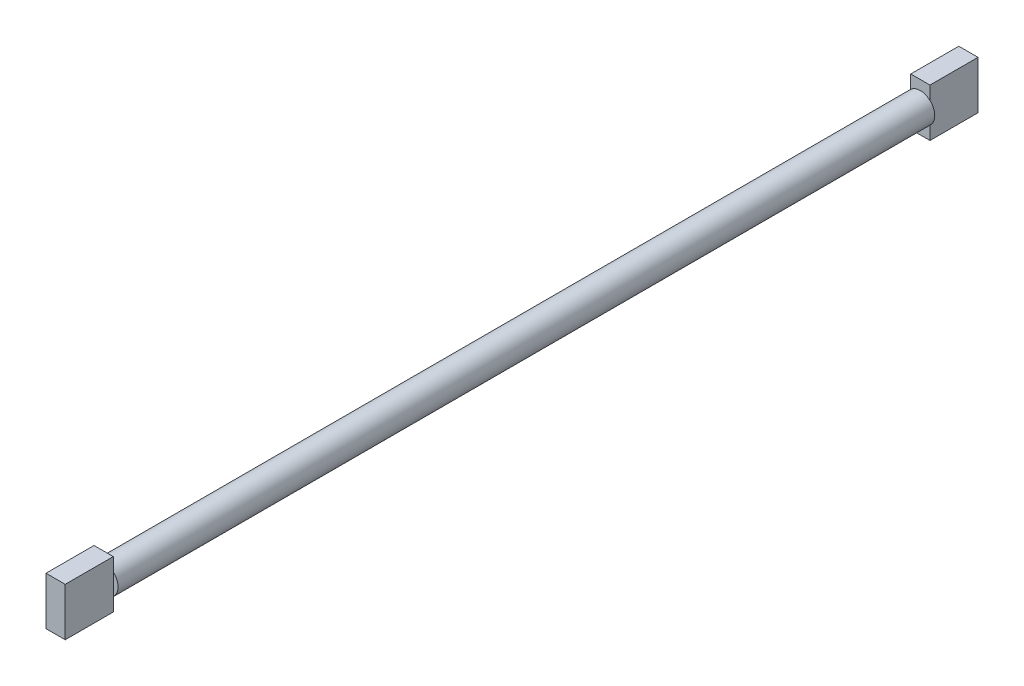
ISO-10303-21;
HEADER;
FILE_DESCRIPTION(('STEP AP214'),'2;1');
FILE_NAME('part.step','',(''),(''),'','','');
FILE_SCHEMA(('AUTOMOTIVE_DESIGN { 1 0 10303 214 1 1 1 1 }'));
ENDSEC;
DATA;
#1=APPLICATION_CONTEXT('core data for automotive mechanical design processes');
#2=APPLICATION_PROTOCOL_DEFINITION('international standard','automotive_design',2000,#1);
#3=PRODUCT_CONTEXT('',#1,'mechanical');
#4=PRODUCT('Part','Part','',(#3));
#5=PRODUCT_RELATED_PRODUCT_CATEGORY('part','',(#4));
#6=PRODUCT_DEFINITION_FORMATION('','',#4);
#7=PRODUCT_DEFINITION_CONTEXT('part definition',#1,'design');
#8=PRODUCT_DEFINITION('design','',#6,#7);
#9=PRODUCT_DEFINITION_SHAPE('','',#8);
#10=(LENGTH_UNIT() NAMED_UNIT(*) SI_UNIT(.MILLI.,.METRE.));
#11=(NAMED_UNIT(*) PLANE_ANGLE_UNIT() SI_UNIT($,.RADIAN.));
#12=(NAMED_UNIT(*) SI_UNIT($,.STERADIAN.) SOLID_ANGLE_UNIT());
#13=UNCERTAINTY_MEASURE_WITH_UNIT(LENGTH_MEASURE(1.E-05),#10,'distance_accuracy_value','');
#14=(GEOMETRIC_REPRESENTATION_CONTEXT(3) GLOBAL_UNCERTAINTY_ASSIGNED_CONTEXT((#13)) GLOBAL_UNIT_ASSIGNED_CONTEXT((#10,
#11,#12)) REPRESENTATION_CONTEXT('',''));
#15=CARTESIAN_POINT('',(0.,0.,0.));
#16=DIRECTION('',(0.,0.,1.));
#17=DIRECTION('',(1.,0.,0.));
#18=AXIS2_PLACEMENT_3D('',#15,#16,#17);
#19=CARTESIAN_POINT('',(0.,0.,0.));
#20=DIRECTION('',(0.,0.,1.));
#21=DIRECTION('',(1.,0.,0.));
#22=AXIS2_PLACEMENT_3D('',#19,#20,#21);
#23=PLANE('',#22);
#24=CARTESIAN_POINT('',(0.,0.,0.));
#25=DIRECTION('',(0.,0.,1.));
#26=DIRECTION('',(1.,0.,0.));
#27=AXIS2_PLACEMENT_3D('',#24,#25,#26);
#28=CIRCLE('',#27,15.);
#29=CARTESIAN_POINT('',(10.,-11.180339887499,0.));
#30=VERTEX_POINT('',#29);
#31=CARTESIAN_POINT('',(10.,11.180339887499,0.));
#32=VERTEX_POINT('',#31);
#33=EDGE_CURVE('E200',#30,#32,#28,.T.);
#34=ORIENTED_EDGE('',*,*,#33,.F.);
#35=DIRECTION('',(0.,1.,0.));
#36=VECTOR('',#35,1.);
#37=CARTESIAN_POINT('',(10.,25.,0.));
#38=LINE('',#37,#36);
#39=EDGE_CURVE('E11',#30,#32,#38,.T.);
#40=ORIENTED_EDGE('',*,*,#39,.T.);
#41=EDGE_LOOP('',(#34,#40));
#42=FACE_BOUND('',#41,.T.);
#43=ADVANCED_FACE('F33',(#42),#23,.F.);
#44=CARTESIAN_POINT('',(0.,0.,850.));
#45=DIRECTION('',(0.,0.,1.));
#46=DIRECTION('',(1.,0.,0.));
#47=AXIS2_PLACEMENT_3D('',#44,#45,#46);
#48=PLANE('',#47);
#49=DIRECTION('',(0.,1.,0.));
#50=VECTOR('',#49,1.);
#51=CARTESIAN_POINT('',(10.,25.,850.));
#52=LINE('',#51,#50);
#53=CARTESIAN_POINT('',(10.,-11.180339887499,850.));
#54=VERTEX_POINT('',#53);
#55=CARTESIAN_POINT('',(10.,11.180339887499,850.));
#56=VERTEX_POINT('',#55);
#57=EDGE_CURVE('E59',#54,#56,#52,.T.);
#58=ORIENTED_EDGE('',*,*,#57,.F.);
#59=CARTESIAN_POINT('',(0.,0.,850.));
#60=DIRECTION('',(0.,0.,1.));
#61=DIRECTION('',(1.,0.,0.));
#62=AXIS2_PLACEMENT_3D('',#59,#60,#61);
#63=CIRCLE('',#62,15.);
#64=EDGE_CURVE('E204',#54,#56,#63,.T.);
#65=ORIENTED_EDGE('',*,*,#64,.T.);
#66=EDGE_LOOP('',(#58,#65));
#67=FACE_BOUND('',#66,.T.);
#68=ADVANCED_FACE('F267',(#67),#48,.T.);
#69=CARTESIAN_POINT('',(0.,0.,850.));
#70=DIRECTION('',(0.,0.,-1.));
#71=DIRECTION('',(-1.,0.,0.));
#72=AXIS2_PLACEMENT_3D('',#69,#70,#71);
#73=CYLINDRICAL_SURFACE('',#72,15.);
#74=CARTESIAN_POINT('',(-10.,11.180339887499,850.));
#75=VERTEX_POINT('',#74);
#76=EDGE_CURVE('E201',#56,#75,#63,.T.);
#77=ORIENTED_EDGE('',*,*,#76,.F.);
#78=ORIENTED_EDGE('',*,*,#64,.F.);
#79=CARTESIAN_POINT('',(-10.,-11.180339887499,850.));
#80=VERTEX_POINT('',#79);
#81=EDGE_CURVE('E210',#80,#54,#63,.T.);
#82=ORIENTED_EDGE('',*,*,#81,.F.);
#83=EDGE_CURVE('E203',#75,#80,#63,.T.);
#84=ORIENTED_EDGE('',*,*,#83,.F.);
#85=EDGE_LOOP('',(#77,#78,#82,#84));
#86=FACE_BOUND('',#85,.T.);
#87=CARTESIAN_POINT('',(-10.,11.180339887499,0.));
#88=VERTEX_POINT('',#87);
#89=EDGE_CURVE('E37',#32,#88,#28,.T.);
#90=ORIENTED_EDGE('',*,*,#89,.T.);
#91=CARTESIAN_POINT('',(-10.,-11.180339887499,0.));
#92=VERTEX_POINT('',#91);
#93=EDGE_CURVE('E213',#88,#92,#28,.T.);
#94=ORIENTED_EDGE('',*,*,#93,.T.);
#95=EDGE_CURVE('E217',#92,#30,#28,.T.);
#96=ORIENTED_EDGE('',*,*,#95,.T.);
#97=ORIENTED_EDGE('',*,*,#33,.T.);
#98=EDGE_LOOP('',(#90,#94,#96,#97));
#99=FACE_BOUND('',#98,.T.);
#100=ADVANCED_FACE('F35',(#86,#99),#73,.T.);
#101=DIRECTION('',(0.,-1.,0.));
#102=VECTOR('',#101,1.);
#103=CARTESIAN_POINT('',(-10.,25.,850.));
#104=LINE('',#103,#102);
#105=EDGE_CURVE('E188',#75,#80,#104,.T.);
#106=ORIENTED_EDGE('',*,*,#105,.F.);
#107=ORIENTED_EDGE('',*,*,#83,.T.);
#108=EDGE_LOOP('',(#106,#107));
#109=FACE_BOUND('',#108,.T.);
#110=ADVANCED_FACE('F251',(#109),#48,.T.);
#111=ORIENTED_EDGE('',*,*,#93,.F.);
#112=DIRECTION('',(0.,-1.,0.));
#113=VECTOR('',#112,1.);
#114=CARTESIAN_POINT('',(-10.,25.,0.));
#115=LINE('',#114,#113);
#116=EDGE_CURVE('E42',#88,#92,#115,.T.);
#117=ORIENTED_EDGE('',*,*,#116,.T.);
#118=EDGE_LOOP('',(#111,#117));
#119=FACE_BOUND('',#118,.T.);
#120=ADVANCED_FACE('F225',(#119),#23,.F.);
#121=CARTESIAN_POINT('',(0.,0.,850.));
#122=DIRECTION('',(0.,0.,1.));
#123=DIRECTION('',(1.,0.,0.));
#124=AXIS2_PLACEMENT_3D('',#121,#122,#123);
#125=PLANE('',#124);
#126=CARTESIAN_POINT('',(10.,25.,850.));
#127=VERTEX_POINT('',#126);
#128=EDGE_CURVE('E137',#56,#127,#52,.T.);
#129=ORIENTED_EDGE('',*,*,#128,.F.);
#130=ORIENTED_EDGE('',*,*,#76,.T.);
#131=CARTESIAN_POINT('',(-10.,25.,850.));
#132=VERTEX_POINT('',#131);
#133=EDGE_CURVE('E185',#132,#75,#104,.T.);
#134=ORIENTED_EDGE('',*,*,#133,.F.);
#135=DIRECTION('',(-1.,0.,0.));
#136=VECTOR('',#135,1.);
#137=CARTESIAN_POINT('',(-10.,25.,850.));
#138=LINE('',#137,#136);
#139=EDGE_CURVE('E182',#127,#132,#138,.T.);
#140=ORIENTED_EDGE('',*,*,#139,.F.);
#141=EDGE_LOOP('',(#129,#130,#134,#140));
#142=FACE_BOUND('',#141,.T.);
#143=ADVANCED_FACE('F232',(#142),#125,.F.);
#144=CARTESIAN_POINT('',(-9.99999999999999,-25.,850.));
#145=VERTEX_POINT('',#144);
#146=EDGE_CURVE('E184',#80,#145,#104,.T.);
#147=ORIENTED_EDGE('',*,*,#146,.F.);
#148=ORIENTED_EDGE('',*,*,#81,.T.);
#149=CARTESIAN_POINT('',(10.,-25.,850.));
#150=VERTEX_POINT('',#149);
#151=EDGE_CURVE('E179',#150,#54,#52,.T.);
#152=ORIENTED_EDGE('',*,*,#151,.F.);
#153=DIRECTION('',(1.,0.,0.));
#154=VECTOR('',#153,1.);
#155=CARTESIAN_POINT('',(-9.99999999999999,-25.,850.));
#156=LINE('',#155,#154);
#157=EDGE_CURVE('E172',#145,#150,#156,.T.);
#158=ORIENTED_EDGE('',*,*,#157,.F.);
#159=EDGE_LOOP('',(#147,#148,#152,#158));
#160=FACE_BOUND('',#159,.T.);
#161=ADVANCED_FACE('F246',(#160),#125,.F.);
#162=CARTESIAN_POINT('',(10.,25.,900.));
#163=DIRECTION('',(-1.,0.,0.));
#164=DIRECTION('',(0.,-1.,0.));
#165=AXIS2_PLACEMENT_3D('',#162,#163,#164);
#166=PLANE('',#165);
#167=ORIENTED_EDGE('',*,*,#151,.T.);
#168=ORIENTED_EDGE('',*,*,#57,.T.);
#169=ORIENTED_EDGE('',*,*,#128,.T.);
#170=DIRECTION('',(0.,0.,-1.));
#171=VECTOR('',#170,1.);
#172=CARTESIAN_POINT('',(10.,25.,900.));
#173=LINE('',#172,#171);
#174=CARTESIAN_POINT('',(10.,25.,900.));
#175=VERTEX_POINT('',#174);
#176=EDGE_CURVE('E198',#175,#127,#173,.T.);
#177=ORIENTED_EDGE('',*,*,#176,.F.);
#178=DIRECTION('',(0.,1.,0.));
#179=VECTOR('',#178,1.);
#180=CARTESIAN_POINT('',(10.,25.,900.));
#181=LINE('',#180,#179);
#182=CARTESIAN_POINT('',(10.,-25.,900.));
#183=VERTEX_POINT('',#182);
#184=EDGE_CURVE('E168',#183,#175,#181,.T.);
#185=ORIENTED_EDGE('',*,*,#184,.F.);
#186=DIRECTION('',(0.,0.,-1.));
#187=VECTOR('',#186,1.);
#188=CARTESIAN_POINT('',(10.,-25.,900.));
#189=LINE('',#188,#187);
#190=EDGE_CURVE('E178',#183,#150,#189,.T.);
#191=ORIENTED_EDGE('',*,*,#190,.T.);
#192=EDGE_LOOP('',(#167,#168,#169,#177,#185,#191));
#193=FACE_BOUND('',#192,.T.);
#194=ADVANCED_FACE('F230',(#193),#166,.F.);
#195=CARTESIAN_POINT('',(-10.,25.,900.));
#196=DIRECTION('',(0.,-1.,0.));
#197=DIRECTION('',(0.,0.,-1.));
#198=AXIS2_PLACEMENT_3D('',#195,#196,#197);
#199=PLANE('',#198);
#200=ORIENTED_EDGE('',*,*,#139,.T.);
#201=DIRECTION('',(0.,0.,-1.));
#202=VECTOR('',#201,1.);
#203=CARTESIAN_POINT('',(-10.,25.,900.));
#204=LINE('',#203,#202);
#205=CARTESIAN_POINT('',(-10.,25.,900.));
#206=VERTEX_POINT('',#205);
#207=EDGE_CURVE('E195',#206,#132,#204,.T.);
#208=ORIENTED_EDGE('',*,*,#207,.F.);
#209=DIRECTION('',(-1.,0.,0.));
#210=VECTOR('',#209,1.);
#211=CARTESIAN_POINT('',(-10.,25.,900.));
#212=LINE('',#211,#210);
#213=EDGE_CURVE('E171',#175,#206,#212,.T.);
#214=ORIENTED_EDGE('',*,*,#213,.F.);
#215=ORIENTED_EDGE('',*,*,#176,.T.);
#216=EDGE_LOOP('',(#200,#208,#214,#215));
#217=FACE_BOUND('',#216,.T.);
#218=ADVANCED_FACE('F235',(#217),#199,.F.);
#219=CARTESIAN_POINT('',(-10.,25.,900.));
#220=DIRECTION('',(1.,0.,0.));
#221=DIRECTION('',(0.,1.,0.));
#222=AXIS2_PLACEMENT_3D('',#219,#220,#221);
#223=PLANE('',#222);
#224=ORIENTED_EDGE('',*,*,#133,.T.);
#225=ORIENTED_EDGE('',*,*,#105,.T.);
#226=ORIENTED_EDGE('',*,*,#146,.T.);
#227=DIRECTION('',(0.,0.,-1.));
#228=VECTOR('',#227,1.);
#229=CARTESIAN_POINT('',(-9.99999999999999,-25.,900.));
#230=LINE('',#229,#228);
#231=CARTESIAN_POINT('',(-9.99999999999999,-25.,900.));
#232=VERTEX_POINT('',#231);
#233=EDGE_CURVE('E192',#232,#145,#230,.T.);
#234=ORIENTED_EDGE('',*,*,#233,.F.);
#235=DIRECTION('',(0.,-1.,0.));
#236=VECTOR('',#235,1.);
#237=CARTESIAN_POINT('',(-10.,25.,900.));
#238=LINE('',#237,#236);
#239=EDGE_CURVE('E174',#206,#232,#238,.T.);
#240=ORIENTED_EDGE('',*,*,#239,.F.);
#241=ORIENTED_EDGE('',*,*,#207,.T.);
#242=EDGE_LOOP('',(#224,#225,#226,#234,#240,#241));
#243=FACE_BOUND('',#242,.T.);
#244=ADVANCED_FACE('F253',(#243),#223,.F.);
#245=CARTESIAN_POINT('',(-9.99999999999999,-25.,900.));
#246=DIRECTION('',(0.,1.,0.));
#247=DIRECTION('',(0.,0.,1.));
#248=AXIS2_PLACEMENT_3D('',#245,#246,#247);
#249=PLANE('',#248);
#250=ORIENTED_EDGE('',*,*,#157,.T.);
#251=ORIENTED_EDGE('',*,*,#190,.F.);
#252=DIRECTION('',(1.,0.,0.));
#253=VECTOR('',#252,1.);
#254=CARTESIAN_POINT('',(-9.99999999999999,-25.,900.));
#255=LINE('',#254,#253);
#256=EDGE_CURVE('E176',#232,#183,#255,.T.);
#257=ORIENTED_EDGE('',*,*,#256,.F.);
#258=ORIENTED_EDGE('',*,*,#233,.T.);
#259=EDGE_LOOP('',(#250,#251,#257,#258));
#260=FACE_BOUND('',#259,.T.);
#261=ADVANCED_FACE('F255',(#260),#249,.F.);
#262=CARTESIAN_POINT('',(0.,0.,900.));
#263=DIRECTION('',(0.,0.,1.));
#264=DIRECTION('',(1.,0.,0.));
#265=AXIS2_PLACEMENT_3D('',#262,#263,#264);
#266=PLANE('',#265);
#267=ORIENTED_EDGE('',*,*,#184,.T.);
#268=ORIENTED_EDGE('',*,*,#213,.T.);
#269=ORIENTED_EDGE('',*,*,#239,.T.);
#270=ORIENTED_EDGE('',*,*,#256,.T.);
#271=EDGE_LOOP('',(#267,#268,#269,#270));
#272=FACE_BOUND('',#271,.T.);
#273=ADVANCED_FACE('F238',(#272),#266,.T.);
#274=CARTESIAN_POINT('',(0.,0.,0.));
#275=DIRECTION('',(0.,0.,-1.));
#276=DIRECTION('',(1.,0.,0.));
#277=AXIS2_PLACEMENT_3D('',#274,#275,#276);
#278=PLANE('',#277);
#279=ORIENTED_EDGE('',*,*,#89,.F.);
#280=CARTESIAN_POINT('',(10.,25.,0.));
#281=VERTEX_POINT('',#280);
#282=EDGE_CURVE('E45',#32,#281,#38,.T.);
#283=ORIENTED_EDGE('',*,*,#282,.T.);
#284=DIRECTION('',(-1.,0.,0.));
#285=VECTOR('',#284,1.);
#286=CARTESIAN_POINT('',(-10.,25.,0.));
#287=LINE('',#286,#285);
#288=CARTESIAN_POINT('',(-10.,25.,0.));
#289=VERTEX_POINT('',#288);
#290=EDGE_CURVE('E148',#281,#289,#287,.T.);
#291=ORIENTED_EDGE('',*,*,#290,.T.);
#292=EDGE_CURVE('E159',#289,#88,#115,.T.);
#293=ORIENTED_EDGE('',*,*,#292,.T.);
#294=EDGE_LOOP('',(#279,#283,#291,#293));
#295=FACE_BOUND('',#294,.T.);
#296=ADVANCED_FACE('F262',(#295),#278,.F.);
#297=CARTESIAN_POINT('',(10.,25.,-50.));
#298=DIRECTION('',(1.,0.,0.));
#299=DIRECTION('',(0.,1.,0.));
#300=AXIS2_PLACEMENT_3D('',#297,#298,#299);
#301=PLANE('',#300);
#302=CARTESIAN_POINT('',(10.,-25.,0.));
#303=VERTEX_POINT('',#302);
#304=EDGE_CURVE('E44',#303,#30,#38,.T.);
#305=ORIENTED_EDGE('',*,*,#304,.F.);
#306=DIRECTION('',(0.,0.,1.));
#307=VECTOR('',#306,1.);
#308=CARTESIAN_POINT('',(10.,-25.,-50.));
#309=LINE('',#308,#307);
#310=CARTESIAN_POINT('',(10.,-25.,-50.));
#311=VERTEX_POINT('',#310);
#312=EDGE_CURVE('E126',#311,#303,#309,.T.);
#313=ORIENTED_EDGE('',*,*,#312,.F.);
#314=DIRECTION('',(0.,1.,0.));
#315=VECTOR('',#314,1.);
#316=CARTESIAN_POINT('',(10.,25.,-50.));
#317=LINE('',#316,#315);
#318=CARTESIAN_POINT('',(10.,25.,-50.));
#319=VERTEX_POINT('',#318);
#320=EDGE_CURVE('E130',#311,#319,#317,.T.);
#321=ORIENTED_EDGE('',*,*,#320,.T.);
#322=DIRECTION('',(0.,0.,1.));
#323=VECTOR('',#322,1.);
#324=CARTESIAN_POINT('',(10.,25.,-50.));
#325=LINE('',#324,#323);
#326=EDGE_CURVE('E155',#319,#281,#325,.T.);
#327=ORIENTED_EDGE('',*,*,#326,.T.);
#328=ORIENTED_EDGE('',*,*,#282,.F.);
#329=ORIENTED_EDGE('',*,*,#39,.F.);
#330=EDGE_LOOP('',(#305,#313,#321,#327,#328,#329));
#331=FACE_BOUND('',#330,.T.);
#332=ADVANCED_FACE('F128',(#331),#301,.T.);
#333=CARTESIAN_POINT('',(-9.99999999999999,-25.,-50.));
#334=DIRECTION('',(0.,-1.,0.));
#335=DIRECTION('',(0.,0.,-1.));
#336=AXIS2_PLACEMENT_3D('',#333,#334,#335);
#337=PLANE('',#336);
#338=DIRECTION('',(1.,0.,0.));
#339=VECTOR('',#338,1.);
#340=CARTESIAN_POINT('',(-9.99999999999999,-25.,0.));
#341=LINE('',#340,#339);
#342=CARTESIAN_POINT('',(-9.99999999999999,-25.,0.));
#343=VERTEX_POINT('',#342);
#344=EDGE_CURVE('E157',#343,#303,#341,.T.);
#345=ORIENTED_EDGE('',*,*,#344,.F.);
#346=DIRECTION('',(0.,0.,1.));
#347=VECTOR('',#346,1.);
#348=CARTESIAN_POINT('',(-9.99999999999999,-25.,-50.));
#349=LINE('',#348,#347);
#350=CARTESIAN_POINT('',(-9.99999999999999,-25.,-50.));
#351=VERTEX_POINT('',#350);
#352=EDGE_CURVE('E138',#351,#343,#349,.T.);
#353=ORIENTED_EDGE('',*,*,#352,.F.);
#354=DIRECTION('',(1.,0.,0.));
#355=VECTOR('',#354,1.);
#356=CARTESIAN_POINT('',(-9.99999999999999,-25.,-50.));
#357=LINE('',#356,#355);
#358=EDGE_CURVE('E144',#351,#311,#357,.T.);
#359=ORIENTED_EDGE('',*,*,#358,.T.);
#360=ORIENTED_EDGE('',*,*,#312,.T.);
#361=EDGE_LOOP('',(#345,#353,#359,#360));
#362=FACE_BOUND('',#361,.T.);
#363=ADVANCED_FACE('F150',(#362),#337,.T.);
#364=CARTESIAN_POINT('',(-10.,25.,-50.));
#365=DIRECTION('',(-1.,0.,0.));
#366=DIRECTION('',(0.,-1.,0.));
#367=AXIS2_PLACEMENT_3D('',#364,#365,#366);
#368=PLANE('',#367);
#369=ORIENTED_EDGE('',*,*,#292,.F.);
#370=DIRECTION('',(0.,0.,1.));
#371=VECTOR('',#370,1.);
#372=CARTESIAN_POINT('',(-10.,25.,-50.));
#373=LINE('',#372,#371);
#374=CARTESIAN_POINT('',(-10.,25.,-50.));
#375=VERTEX_POINT('',#374);
#376=EDGE_CURVE('E165',#375,#289,#373,.T.);
#377=ORIENTED_EDGE('',*,*,#376,.F.);
#378=DIRECTION('',(0.,-1.,0.));
#379=VECTOR('',#378,1.);
#380=CARTESIAN_POINT('',(-10.,25.,-50.));
#381=LINE('',#380,#379);
#382=EDGE_CURVE('E151',#375,#351,#381,.T.);
#383=ORIENTED_EDGE('',*,*,#382,.T.);
#384=ORIENTED_EDGE('',*,*,#352,.T.);
#385=EDGE_CURVE('E52',#92,#343,#115,.T.);
#386=ORIENTED_EDGE('',*,*,#385,.F.);
#387=ORIENTED_EDGE('',*,*,#116,.F.);
#388=EDGE_LOOP('',(#369,#377,#383,#384,#386,#387));
#389=FACE_BOUND('',#388,.T.);
#390=ADVANCED_FACE('F346',(#389),#368,.T.);
#391=CARTESIAN_POINT('',(-10.,25.,-50.));
#392=DIRECTION('',(0.,1.,0.));
#393=DIRECTION('',(0.,0.,1.));
#394=AXIS2_PLACEMENT_3D('',#391,#392,#393);
#395=PLANE('',#394);
#396=ORIENTED_EDGE('',*,*,#290,.F.);
#397=ORIENTED_EDGE('',*,*,#326,.F.);
#398=DIRECTION('',(-1.,0.,0.));
#399=VECTOR('',#398,1.);
#400=CARTESIAN_POINT('',(-10.,25.,-50.));
#401=LINE('',#400,#399);
#402=EDGE_CURVE('E147',#319,#375,#401,.T.);
#403=ORIENTED_EDGE('',*,*,#402,.T.);
#404=ORIENTED_EDGE('',*,*,#376,.T.);
#405=EDGE_LOOP('',(#396,#397,#403,#404));
#406=FACE_BOUND('',#405,.T.);
#407=ADVANCED_FACE('F355',(#406),#395,.T.);
#408=CARTESIAN_POINT('',(0.,0.,-50.));
#409=DIRECTION('',(0.,0.,-1.));
#410=DIRECTION('',(1.,0.,0.));
#411=AXIS2_PLACEMENT_3D('',#408,#409,#410);
#412=PLANE('',#411);
#413=ORIENTED_EDGE('',*,*,#320,.F.);
#414=ORIENTED_EDGE('',*,*,#358,.F.);
#415=ORIENTED_EDGE('',*,*,#382,.F.);
#416=ORIENTED_EDGE('',*,*,#402,.F.);
#417=EDGE_LOOP('',(#413,#414,#415,#416));
#418=FACE_BOUND('',#417,.T.);
#419=ADVANCED_FACE('F142',(#418),#412,.T.);
#420=ORIENTED_EDGE('',*,*,#95,.F.);
#421=ORIENTED_EDGE('',*,*,#385,.T.);
#422=ORIENTED_EDGE('',*,*,#344,.T.);
#423=ORIENTED_EDGE('',*,*,#304,.T.);
#424=EDGE_LOOP('',(#420,#421,#422,#423));
#425=FACE_BOUND('',#424,.T.);
#426=ADVANCED_FACE('F223',(#425),#278,.F.);
#427=CLOSED_SHELL('',(#43,#68,#100,#110,#120,#143,#161,#194,#218,#244,#261,#273,#296,#332,#363,
#390,#407,#419,#426));
#428=MANIFOLD_SOLID_BREP('B2',#427);
#429=ADVANCED_BREP_SHAPE_REPRESENTATION('',(#18,#428),#14);
#430=SHAPE_DEFINITION_REPRESENTATION(#9,#429);
ENDSEC;
END-ISO-10303-21;
